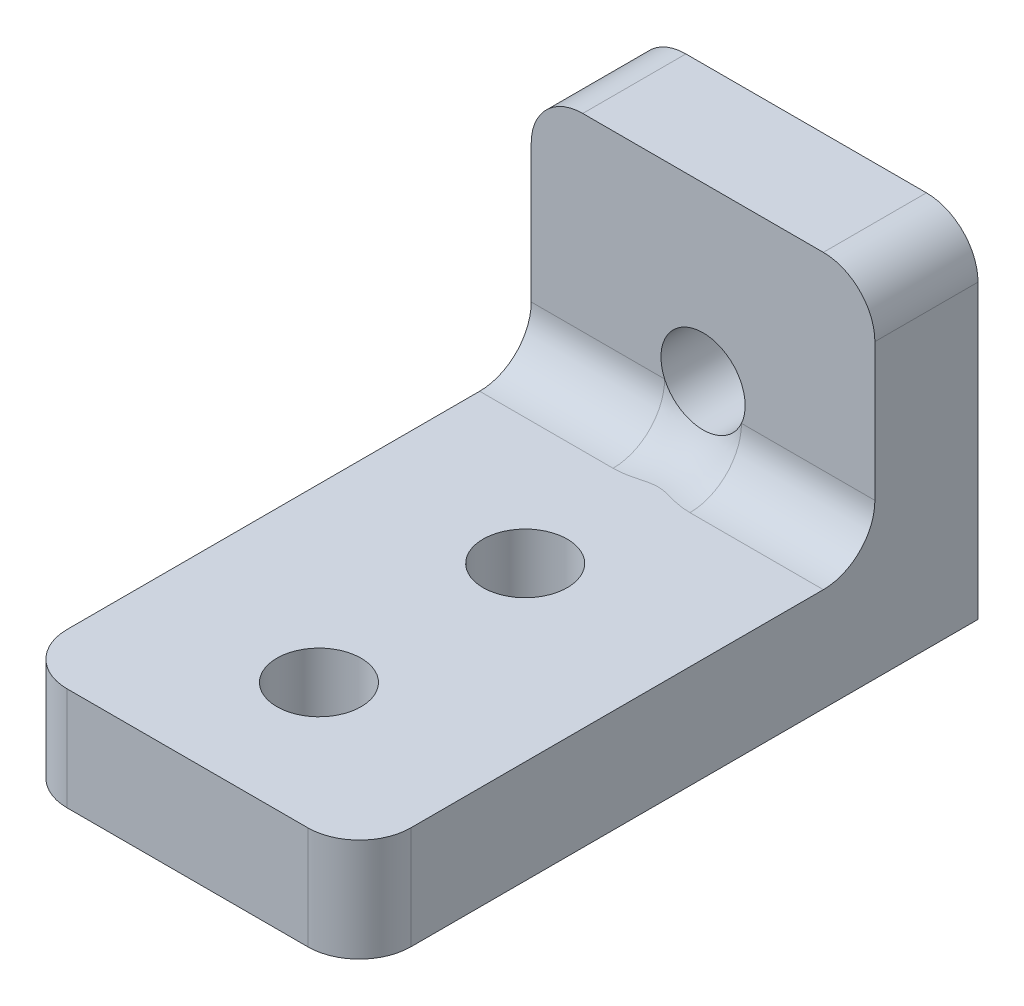
ISO-10303-21;
HEADER;
FILE_DESCRIPTION(('STEP AP214'),'2;1');
FILE_NAME('part.step','',(''),(''),'','','');
FILE_SCHEMA(('AUTOMOTIVE_DESIGN { 1 0 10303 214 1 1 1 1 }'));
ENDSEC;
DATA;
#1=APPLICATION_CONTEXT('core data for automotive mechanical design processes');
#2=APPLICATION_PROTOCOL_DEFINITION('international standard','automotive_design',2000,#1);
#3=PRODUCT_CONTEXT('',#1,'mechanical');
#4=PRODUCT('Part','Part','',(#3));
#5=PRODUCT_RELATED_PRODUCT_CATEGORY('part','',(#4));
#6=PRODUCT_DEFINITION_FORMATION('','',#4);
#7=PRODUCT_DEFINITION_CONTEXT('part definition',#1,'design');
#8=PRODUCT_DEFINITION('design','',#6,#7);
#9=PRODUCT_DEFINITION_SHAPE('','',#8);
#10=(LENGTH_UNIT() NAMED_UNIT(*) SI_UNIT(.MILLI.,.METRE.));
#11=(NAMED_UNIT(*) PLANE_ANGLE_UNIT() SI_UNIT($,.RADIAN.));
#12=(NAMED_UNIT(*) SI_UNIT($,.STERADIAN.) SOLID_ANGLE_UNIT());
#13=UNCERTAINTY_MEASURE_WITH_UNIT(LENGTH_MEASURE(1.E-05),#10,'distance_accuracy_value','');
#14=(GEOMETRIC_REPRESENTATION_CONTEXT(3) GLOBAL_UNCERTAINTY_ASSIGNED_CONTEXT((#13)) GLOBAL_UNIT_ASSIGNED_CONTEXT((#10,
#11,#12)) REPRESENTATION_CONTEXT('',''));
#15=CARTESIAN_POINT('',(0.,0.,0.));
#16=DIRECTION('',(0.,0.,1.));
#17=DIRECTION('',(1.,0.,0.));
#18=AXIS2_PLACEMENT_3D('',#15,#16,#17);
#19=CARTESIAN_POINT('',(0.,0.,6.));
#20=DIRECTION('',(1.,0.,0.));
#21=DIRECTION('',(0.,1.,0.));
#22=AXIS2_PLACEMENT_3D('',#19,#20,#21);
#23=PLANE('',#22);
#24=DIRECTION('',(0.,-1.,0.));
#25=VECTOR('',#24,1.);
#26=CARTESIAN_POINT('',(0.,0.,6.));
#27=LINE('',#26,#25);
#28=CARTESIAN_POINT('',(0.,-3.,6.));
#29=VERTEX_POINT('',#28);
#30=CARTESIAN_POINT('',(0.,-11.,6.));
#31=VERTEX_POINT('',#30);
#32=EDGE_CURVE('E167',#29,#31,#27,.T.);
#33=ORIENTED_EDGE('',*,*,#32,.F.);
#34=DIRECTION('',(0.,0.,-1.));
#35=VECTOR('',#34,1.);
#36=CARTESIAN_POINT('',(0.,-3.,6.));
#37=LINE('',#36,#35);
#38=CARTESIAN_POINT('',(0.,-3.,0.));
#39=VERTEX_POINT('',#38);
#40=EDGE_CURVE('E153',#29,#39,#37,.T.);
#41=ORIENTED_EDGE('',*,*,#40,.T.);
#42=DIRECTION('',(0.,-1.,0.));
#43=VECTOR('',#42,1.);
#44=CARTESIAN_POINT('',(0.,0.,0.));
#45=LINE('',#44,#43);
#46=CARTESIAN_POINT('',(0.,-20.,0.));
#47=VERTEX_POINT('',#46);
#48=EDGE_CURVE('E151',#39,#47,#45,.T.);
#49=ORIENTED_EDGE('',*,*,#48,.T.);
#50=DIRECTION('',(0.,0.,-1.));
#51=VECTOR('',#50,1.);
#52=CARTESIAN_POINT('',(0.,-20.,6.));
#53=LINE('',#52,#51);
#54=CARTESIAN_POINT('',(0.,-20.,33.));
#55=VERTEX_POINT('',#54);
#56=EDGE_CURVE('E136',#55,#47,#53,.T.);
#57=ORIENTED_EDGE('',*,*,#56,.F.);
#58=DIRECTION('',(0.,-1.,0.));
#59=VECTOR('',#58,1.);
#60=CARTESIAN_POINT('',(0.,0.,33.));
#61=LINE('',#60,#59);
#62=CARTESIAN_POINT('',(0.,-14.,33.));
#63=VERTEX_POINT('',#62);
#64=EDGE_CURVE('E146',#55,#63,#61,.F.);
#65=ORIENTED_EDGE('',*,*,#64,.T.);
#66=DIRECTION('',(0.,0.,-1.));
#67=VECTOR('',#66,1.);
#68=CARTESIAN_POINT('',(0.,-14.,36.));
#69=LINE('',#68,#67);
#70=CARTESIAN_POINT('',(0.,-14.,9.));
#71=VERTEX_POINT('',#70);
#72=EDGE_CURVE('E267',#63,#71,#69,.T.);
#73=ORIENTED_EDGE('',*,*,#72,.T.);
#74=CARTESIAN_POINT('',(0.,-11.,9.));
#75=DIRECTION('',(1.,0.,0.));
#76=DIRECTION('',(0.,1.,0.));
#77=AXIS2_PLACEMENT_3D('',#74,#75,#76);
#78=CIRCLE('',#77,3.);
#79=EDGE_CURVE('E48',#71,#31,#78,.T.);
#80=ORIENTED_EDGE('',*,*,#79,.T.);
#81=EDGE_LOOP('',(#33,#41,#49,#57,#65,#73,#80));
#82=FACE_BOUND('',#81,.T.);
#83=ADVANCED_FACE('F35',(#82),#23,.F.);
#84=CARTESIAN_POINT('',(0.,-20.,6.));
#85=DIRECTION('',(0.,1.,0.));
#86=DIRECTION('',(0.,0.,1.));
#87=AXIS2_PLACEMENT_3D('',#84,#85,#86);
#88=PLANE('',#87);
#89=CARTESIAN_POINT('',(10.,-20.,16.35));
#90=DIRECTION('',(0.,1.,0.));
#91=DIRECTION('',(0.,0.,1.));
#92=AXIS2_PLACEMENT_3D('',#89,#90,#91);
#93=CIRCLE('',#92,2.45);
#94=CARTESIAN_POINT('',(10.,-20.,18.8));
#95=VERTEX_POINT('',#94);
#96=EDGE_CURVE('E246',#95,#95,#93,.T.);
#97=ORIENTED_EDGE('',*,*,#96,.T.);
#98=EDGE_LOOP('',(#97));
#99=FACE_BOUND('',#98,.T.);
#100=CARTESIAN_POINT('',(10.,-20.,28.35));
#101=DIRECTION('',(0.,1.,0.));
#102=DIRECTION('',(0.,0.,1.));
#103=AXIS2_PLACEMENT_3D('',#100,#101,#102);
#104=CIRCLE('',#103,2.45);
#105=CARTESIAN_POINT('',(10.,-20.,30.8));
#106=VERTEX_POINT('',#105);
#107=EDGE_CURVE('E314',#106,#106,#104,.T.);
#108=ORIENTED_EDGE('',*,*,#107,.T.);
#109=EDGE_LOOP('',(#108));
#110=FACE_BOUND('',#109,.T.);
#111=DIRECTION('',(0.,0.,-1.));
#112=VECTOR('',#111,1.);
#113=CARTESIAN_POINT('',(20.,-20.,6.));
#114=LINE('',#113,#112);
#115=CARTESIAN_POINT('',(20.,-20.,33.));
#116=VERTEX_POINT('',#115);
#117=CARTESIAN_POINT('',(20.,-20.,0.));
#118=VERTEX_POINT('',#117);
#119=EDGE_CURVE('E147',#116,#118,#114,.T.);
#120=ORIENTED_EDGE('',*,*,#119,.F.);
#121=CARTESIAN_POINT('',(17.,-20.,33.));
#122=DIRECTION('',(0.,1.,0.));
#123=DIRECTION('',(0.,0.,1.));
#124=AXIS2_PLACEMENT_3D('',#121,#122,#123);
#125=CIRCLE('',#124,3.);
#126=CARTESIAN_POINT('',(17.,-20.,36.));
#127=VERTEX_POINT('',#126);
#128=EDGE_CURVE('E201',#116,#127,#125,.F.);
#129=ORIENTED_EDGE('',*,*,#128,.T.);
#130=DIRECTION('',(1.,0.,0.));
#131=VECTOR('',#130,1.);
#132=CARTESIAN_POINT('',(0.,-20.,36.));
#133=LINE('',#132,#131);
#134=CARTESIAN_POINT('',(3.,-20.,36.));
#135=VERTEX_POINT('',#134);
#136=EDGE_CURVE('E273',#135,#127,#133,.T.);
#137=ORIENTED_EDGE('',*,*,#136,.F.);
#138=CARTESIAN_POINT('',(3.,-20.,33.));
#139=DIRECTION('',(0.,1.,0.));
#140=DIRECTION('',(0.,0.,1.));
#141=AXIS2_PLACEMENT_3D('',#138,#139,#140);
#142=CIRCLE('',#141,3.);
#143=EDGE_CURVE('E144',#135,#55,#142,.F.);
#144=ORIENTED_EDGE('',*,*,#143,.T.);
#145=ORIENTED_EDGE('',*,*,#56,.T.);
#146=DIRECTION('',(1.,0.,0.));
#147=VECTOR('',#146,1.);
#148=CARTESIAN_POINT('',(0.,-20.,0.));
#149=LINE('',#148,#147);
#150=EDGE_CURVE('E141',#47,#118,#149,.T.);
#151=ORIENTED_EDGE('',*,*,#150,.T.);
#152=EDGE_LOOP('',(#120,#129,#137,#144,#145,#151));
#153=FACE_BOUND('',#152,.T.);
#154=ADVANCED_FACE('F139',(#99,#110,#153),#88,.F.);
#155=CARTESIAN_POINT('',(20.,0.,6.));
#156=DIRECTION('',(-1.,0.,0.));
#157=DIRECTION('',(0.,-1.,0.));
#158=AXIS2_PLACEMENT_3D('',#155,#156,#157);
#159=PLANE('',#158);
#160=DIRECTION('',(0.,1.,0.));
#161=VECTOR('',#160,1.);
#162=CARTESIAN_POINT('',(20.,0.,0.));
#163=LINE('',#162,#161);
#164=CARTESIAN_POINT('',(20.,-3.,0.));
#165=VERTEX_POINT('',#164);
#166=EDGE_CURVE('E159',#118,#165,#163,.T.);
#167=ORIENTED_EDGE('',*,*,#166,.T.);
#168=DIRECTION('',(0.,0.,-1.));
#169=VECTOR('',#168,1.);
#170=CARTESIAN_POINT('',(20.,-3.,6.));
#171=LINE('',#170,#169);
#172=CARTESIAN_POINT('',(20.,-3.,6.));
#173=VERTEX_POINT('',#172);
#174=EDGE_CURVE('E187',#165,#173,#171,.F.);
#175=ORIENTED_EDGE('',*,*,#174,.T.);
#176=DIRECTION('',(0.,1.,0.));
#177=VECTOR('',#176,1.);
#178=CARTESIAN_POINT('',(20.,0.,6.));
#179=LINE('',#178,#177);
#180=CARTESIAN_POINT('',(20.,-11.,6.));
#181=VERTEX_POINT('',#180);
#182=EDGE_CURVE('E278',#181,#173,#179,.T.);
#183=ORIENTED_EDGE('',*,*,#182,.F.);
#184=CARTESIAN_POINT('',(20.,-11.,9.));
#185=DIRECTION('',(-1.,0.,0.));
#186=DIRECTION('',(0.,-1.,0.));
#187=AXIS2_PLACEMENT_3D('',#184,#185,#186);
#188=CIRCLE('',#187,3.);
#189=CARTESIAN_POINT('',(20.,-14.,9.));
#190=VERTEX_POINT('',#189);
#191=EDGE_CURVE('E11',#181,#190,#188,.T.);
#192=ORIENTED_EDGE('',*,*,#191,.T.);
#193=DIRECTION('',(0.,0.,-1.));
#194=VECTOR('',#193,1.);
#195=CARTESIAN_POINT('',(20.,-14.,36.));
#196=LINE('',#195,#194);
#197=CARTESIAN_POINT('',(20.,-14.,33.));
#198=VERTEX_POINT('',#197);
#199=EDGE_CURVE('E155',#198,#190,#196,.T.);
#200=ORIENTED_EDGE('',*,*,#199,.F.);
#201=DIRECTION('',(0.,1.,0.));
#202=VECTOR('',#201,1.);
#203=CARTESIAN_POINT('',(20.,0.,33.));
#204=LINE('',#203,#202);
#205=EDGE_CURVE('E185',#198,#116,#204,.F.);
#206=ORIENTED_EDGE('',*,*,#205,.T.);
#207=ORIENTED_EDGE('',*,*,#119,.T.);
#208=EDGE_LOOP('',(#167,#175,#183,#192,#200,#206,#207));
#209=FACE_BOUND('',#208,.T.);
#210=ADVANCED_FACE('F294',(#209),#159,.F.);
#211=CARTESIAN_POINT('',(0.,0.,6.));
#212=DIRECTION('',(0.,-1.,0.));
#213=DIRECTION('',(0.,0.,-1.));
#214=AXIS2_PLACEMENT_3D('',#211,#212,#213);
#215=PLANE('',#214);
#216=DIRECTION('',(-1.,0.,0.));
#217=VECTOR('',#216,1.);
#218=CARTESIAN_POINT('',(0.,0.,0.));
#219=LINE('',#218,#217);
#220=CARTESIAN_POINT('',(17.,0.,0.));
#221=VERTEX_POINT('',#220);
#222=CARTESIAN_POINT('',(3.,0.,0.));
#223=VERTEX_POINT('',#222);
#224=EDGE_CURVE('E161',#221,#223,#219,.T.);
#225=ORIENTED_EDGE('',*,*,#224,.T.);
#226=DIRECTION('',(0.,0.,-1.));
#227=VECTOR('',#226,1.);
#228=CARTESIAN_POINT('',(3.,0.,6.));
#229=LINE('',#228,#227);
#230=CARTESIAN_POINT('',(3.,0.,6.));
#231=VERTEX_POINT('',#230);
#232=EDGE_CURVE('E179',#223,#231,#229,.F.);
#233=ORIENTED_EDGE('',*,*,#232,.T.);
#234=DIRECTION('',(-1.,0.,0.));
#235=VECTOR('',#234,1.);
#236=CARTESIAN_POINT('',(0.,0.,6.));
#237=LINE('',#236,#235);
#238=CARTESIAN_POINT('',(17.,0.,6.));
#239=VERTEX_POINT('',#238);
#240=EDGE_CURVE('E168',#239,#231,#237,.T.);
#241=ORIENTED_EDGE('',*,*,#240,.F.);
#242=DIRECTION('',(0.,0.,-1.));
#243=VECTOR('',#242,1.);
#244=CARTESIAN_POINT('',(17.,0.,6.));
#245=LINE('',#244,#243);
#246=EDGE_CURVE('E176',#239,#221,#245,.T.);
#247=ORIENTED_EDGE('',*,*,#246,.T.);
#248=EDGE_LOOP('',(#225,#233,#241,#247));
#249=FACE_BOUND('',#248,.T.);
#250=ADVANCED_FACE('F289',(#249),#215,.F.);
#251=CARTESIAN_POINT('',(0.,0.,6.));
#252=DIRECTION('',(0.,0.,1.));
#253=DIRECTION('',(1.,0.,0.));
#254=AXIS2_PLACEMENT_3D('',#251,#252,#253);
#255=PLANE('',#254);
#256=ORIENTED_EDGE('',*,*,#32,.T.);
#257=DIRECTION('',(-1.,0.,0.));
#258=VECTOR('',#257,1.);
#259=CARTESIAN_POINT('',(0.,-11.,6.));
#260=LINE('',#259,#258);
#261=CARTESIAN_POINT('',(7.76337307536549,-11.,6.));
#262=VERTEX_POINT('',#261);
#263=EDGE_CURVE('E249',#31,#262,#260,.F.);
#264=ORIENTED_EDGE('',*,*,#263,.T.);
#265=CARTESIAN_POINT('',(10.,-10.,6.));
#266=DIRECTION('',(0.,0.,1.));
#267=DIRECTION('',(1.,0.,0.));
#268=AXIS2_PLACEMENT_3D('',#265,#266,#267);
#269=CIRCLE('',#268,2.45);
#270=CARTESIAN_POINT('',(12.2366269246345,-11.,6.));
#271=VERTEX_POINT('',#270);
#272=EDGE_CURVE('E310',#271,#262,#269,.T.);
#273=ORIENTED_EDGE('',*,*,#272,.F.);
#274=DIRECTION('',(-1.,0.,0.));
#275=VECTOR('',#274,1.);
#276=CARTESIAN_POINT('',(0.,-11.,6.));
#277=LINE('',#276,#275);
#278=EDGE_CURVE('E56',#271,#181,#277,.F.);
#279=ORIENTED_EDGE('',*,*,#278,.T.);
#280=ORIENTED_EDGE('',*,*,#182,.T.);
#281=CARTESIAN_POINT('',(17.,-3.,6.));
#282=DIRECTION('',(0.,0.,1.));
#283=DIRECTION('',(1.,0.,0.));
#284=AXIS2_PLACEMENT_3D('',#281,#282,#283);
#285=CIRCLE('',#284,3.);
#286=EDGE_CURVE('E181',#173,#239,#285,.T.);
#287=ORIENTED_EDGE('',*,*,#286,.T.);
#288=ORIENTED_EDGE('',*,*,#240,.T.);
#289=CARTESIAN_POINT('',(3.,-3.,6.));
#290=DIRECTION('',(0.,0.,1.));
#291=DIRECTION('',(1.,0.,0.));
#292=AXIS2_PLACEMENT_3D('',#289,#290,#291);
#293=CIRCLE('',#292,3.);
#294=EDGE_CURVE('E183',#231,#29,#293,.T.);
#295=ORIENTED_EDGE('',*,*,#294,.T.);
#296=EDGE_LOOP('',(#256,#264,#273,#279,#280,#287,#288,#295));
#297=FACE_BOUND('',#296,.T.);
#298=ADVANCED_FACE('F233',(#297),#255,.T.);
#299=CARTESIAN_POINT('',(0.,0.,0.));
#300=DIRECTION('',(0.,0.,1.));
#301=DIRECTION('',(1.,0.,0.));
#302=AXIS2_PLACEMENT_3D('',#299,#300,#301);
#303=PLANE('',#302);
#304=CARTESIAN_POINT('',(10.,-10.,0.));
#305=DIRECTION('',(0.,0.,1.));
#306=DIRECTION('',(1.,0.,0.));
#307=AXIS2_PLACEMENT_3D('',#304,#305,#306);
#308=CIRCLE('',#307,2.45);
#309=CARTESIAN_POINT('',(12.45,-10.,0.));
#310=VERTEX_POINT('',#309);
#311=EDGE_CURVE('E306',#310,#310,#308,.T.);
#312=ORIENTED_EDGE('',*,*,#311,.T.);
#313=EDGE_LOOP('',(#312));
#314=FACE_BOUND('',#313,.T.);
#315=ORIENTED_EDGE('',*,*,#48,.F.);
#316=CARTESIAN_POINT('',(3.,-3.,0.));
#317=DIRECTION('',(0.,0.,1.));
#318=DIRECTION('',(1.,0.,0.));
#319=AXIS2_PLACEMENT_3D('',#316,#317,#318);
#320=CIRCLE('',#319,3.);
#321=EDGE_CURVE('E174',#39,#223,#320,.F.);
#322=ORIENTED_EDGE('',*,*,#321,.T.);
#323=ORIENTED_EDGE('',*,*,#224,.F.);
#324=CARTESIAN_POINT('',(17.,-3.,0.));
#325=DIRECTION('',(0.,0.,1.));
#326=DIRECTION('',(1.,0.,0.));
#327=AXIS2_PLACEMENT_3D('',#324,#325,#326);
#328=CIRCLE('',#327,3.);
#329=EDGE_CURVE('E172',#221,#165,#328,.F.);
#330=ORIENTED_EDGE('',*,*,#329,.T.);
#331=ORIENTED_EDGE('',*,*,#166,.F.);
#332=ORIENTED_EDGE('',*,*,#150,.F.);
#333=EDGE_LOOP('',(#315,#322,#323,#330,#331,#332));
#334=FACE_BOUND('',#333,.T.);
#335=ADVANCED_FACE('F157',(#314,#334),#303,.F.);
#336=CARTESIAN_POINT('',(0.,-14.,36.));
#337=DIRECTION('',(0.,-1.,0.));
#338=DIRECTION('',(0.,0.,-1.));
#339=AXIS2_PLACEMENT_3D('',#336,#337,#338);
#340=PLANE('',#339);
#341=CARTESIAN_POINT('',(10.,-14.,16.35));
#342=DIRECTION('',(0.,1.,0.));
#343=DIRECTION('',(0.,0.,1.));
#344=AXIS2_PLACEMENT_3D('',#341,#342,#343);
#345=CIRCLE('',#344,2.45);
#346=CARTESIAN_POINT('',(10.,-14.,18.8));
#347=VERTEX_POINT('',#346);
#348=EDGE_CURVE('E317',#347,#347,#345,.T.);
#349=ORIENTED_EDGE('',*,*,#348,.F.);
#350=EDGE_LOOP('',(#349));
#351=FACE_BOUND('',#350,.T.);
#352=CARTESIAN_POINT('',(10.,-14.,28.35));
#353=DIRECTION('',(0.,1.,0.));
#354=DIRECTION('',(0.,0.,1.));
#355=AXIS2_PLACEMENT_3D('',#352,#353,#354);
#356=CIRCLE('',#355,2.45);
#357=CARTESIAN_POINT('',(10.,-14.,30.8));
#358=VERTEX_POINT('',#357);
#359=EDGE_CURVE('E244',#358,#358,#356,.T.);
#360=ORIENTED_EDGE('',*,*,#359,.F.);
#361=EDGE_LOOP('',(#360));
#362=FACE_BOUND('',#361,.T.);
#363=ORIENTED_EDGE('',*,*,#199,.T.);
#364=DIRECTION('',(-1.,0.,0.));
#365=VECTOR('',#364,1.);
#366=CARTESIAN_POINT('',(0.,-14.,9.));
#367=LINE('',#366,#365);
#368=CARTESIAN_POINT('',(12.2366269246345,-14.,9.));
#369=VERTEX_POINT('',#368);
#370=EDGE_CURVE('E212',#190,#369,#367,.T.);
#371=ORIENTED_EDGE('',*,*,#370,.T.);
#372=CARTESIAN_POINT('',(13.0365617826891,-14.,8.90551453709537));
#373=CARTESIAN_POINT('',(12.2671345198766,-14.,5.75459280735491));
#374=CARTESIAN_POINT('',(12.327060789301,-10.7663472338947,6.));
#375=CARTESIAN_POINT('',(12.950544525121,-14.,8.92653785787751));
#376=CARTESIAN_POINT('',(12.2727685529418,-14.,5.77504625912289));
#377=CARTESIAN_POINT('',(12.3205645673813,-10.7859610895519,6.));
#378=CARTESIAN_POINT('',(12.8636715647208,-14.,8.94397317100025));
#379=CARTESIAN_POINT('',(12.2762584291691,-14.,5.79770823634785));
#380=CARTESIAN_POINT('',(12.3133511153935,-10.8071329363144,6.));
#381=CARTESIAN_POINT('',(12.6888656537901,-14.,8.97181030915909));
#382=CARTESIAN_POINT('',(12.2772754312158,-14.,5.8473045584266));
#383=CARTESIAN_POINT('',(12.2967096075349,-10.853391096599,6.));
#384=CARTESIAN_POINT('',(12.6009334954214,-14.,8.98221709415954));
#385=CARTESIAN_POINT('',(12.274854367162,-14.,5.8741694143294));
#386=CARTESIAN_POINT('',(12.287283119726,-10.8784746342597,6.));
#387=CARTESIAN_POINT('',(12.4266088739132,-14.,8.99600513188879));
#388=CARTESIAN_POINT('',(12.2627529840783,-14.,5.93134791522549));
#389=CARTESIAN_POINT('',(12.265685082357,-10.9327353040991,6.));
#390=CARTESIAN_POINT('',(12.3402287535566,-14.,8.99954564943073));
#391=CARTESIAN_POINT('',(12.2533195839148,-14.,5.96148274376604));
#392=CARTESIAN_POINT('',(12.2535832045833,-10.96180245544,6.));
#393=CARTESIAN_POINT('',(12.1674402637124,-14.,9.00037198805817));
#394=CARTESIAN_POINT('',(12.2256986531207,-14.,6.02540054796675));
#395=CARTESIAN_POINT('',(12.2253494189193,-11.0254475427794,6.));
#396=CARTESIAN_POINT('',(12.0810318928287,-14.,8.99765742957989));
#397=CARTESIAN_POINT('',(12.2076254829321,-14.,6.05909253196025));
#398=CARTESIAN_POINT('',(12.2092172665213,-11.0600258130793,6.));
#399=CARTESIAN_POINT('',(11.9135121384518,-14.,8.98671822224657));
#400=CARTESIAN_POINT('',(12.1620406009486,-14.,6.12768938445565));
#401=CARTESIAN_POINT('',(12.172279975139,-11.1337123927012,6.));
#402=CARTESIAN_POINT('',(11.8323789624775,-14.,8.97881569303437));
#403=CARTESIAN_POINT('',(12.1352900201211,-14.,6.16230209727629));
#404=CARTESIAN_POINT('',(12.1517927426418,-11.1724512728408,6.));
#405=CARTESIAN_POINT('',(11.6707128684689,-14.,8.95833186844076));
#406=CARTESIAN_POINT('',(12.070207958549,-14.,6.2338057435577));
#407=CARTESIAN_POINT('',(12.1035228370925,-11.2570114903926,6.));
#408=CARTESIAN_POINT('',(11.5901799704451,-14.,8.94575041779077));
#409=CARTESIAN_POINT('',(12.0320888194822,-14.,6.27059857516587));
#410=CARTESIAN_POINT('',(12.0757399219444,-11.3028330628123,6.));
#411=CARTESIAN_POINT('',(11.428780591885,-14.,8.91641950068636));
#412=CARTESIAN_POINT('',(11.9412665720138,-14.,6.34613746234845));
#413=CARTESIAN_POINT('',(12.009183476074,-11.4033453992312,6.));
#414=CARTESIAN_POINT('',(11.3479239885203,-14.,8.89961668053617));
#415=CARTESIAN_POINT('',(11.888675952151,-14.,6.38480762201303));
#416=CARTESIAN_POINT('',(11.9702682979208,-11.4581463066904,6.));
#417=CARTESIAN_POINT('',(11.1869406384162,-14.,8.8629601759956));
#418=CARTESIAN_POINT('',(11.7661398757111,-14.,6.46242452436431));
#419=CARTESIAN_POINT('',(11.876549343097,-11.5769803796752,6.));
#420=CARTESIAN_POINT('',(11.1068137363196,-14.,8.84310715789248));
#421=CARTESIAN_POINT('',(11.6966190937893,-14.,6.50128243428658));
#422=CARTESIAN_POINT('',(11.8217490340723,-11.6410115287524,6.));
#423=CARTESIAN_POINT('',(10.981548909411,-14.,8.81078842870554));
#424=CARTESIAN_POINT('',(11.5708695716652,-14.,6.56119443103939));
#425=CARTESIAN_POINT('',(11.7175097886372,-11.7480057732518,6.));
#426=CARTESIAN_POINT('',(10.9362726581216,-14.,8.79884309708353));
#427=CARTESIAN_POINT('',(11.5223186752119,-14.,6.5825321402209));
#428=CARTESIAN_POINT('',(11.6760103533544,-11.7880972077437,6.));
#429=CARTESIAN_POINT('',(10.8457482702793,-14.,8.7748417747122));
#430=CARTESIAN_POINT('',(11.4179608633197,-14.,6.62423402405267));
#431=CARTESIAN_POINT('',(11.5837060078164,-11.8703518141045,6.));
#432=CARTESIAN_POINT('',(10.8005001342925,-14.,8.76278578180708));
#433=CARTESIAN_POINT('',(11.3622498068158,-14.,6.64460097121125));
#434=CARTESIAN_POINT('',(11.532900915911,-11.9125150264037,6.));
#435=CARTESIAN_POINT('',(10.7098522472347,-14.,8.73901772686773));
#436=CARTESIAN_POINT('',(11.2429581441491,-14.,6.68382781910003));
#437=CARTESIAN_POINT('',(11.4200368018224,-11.9977482424769,6.));
#438=CARTESIAN_POINT('',(10.6644523775999,-14.,8.72730611112792));
#439=CARTESIAN_POINT('',(11.1794527029501,-14.,6.70270166754134));
#440=CARTESIAN_POINT('',(11.3579638647006,-12.0408193085943,6.));
#441=CARTESIAN_POINT('',(10.5734110124547,-14.,8.70483262406374));
#442=CARTESIAN_POINT('',(11.0443006766421,-14.,6.73821948518049));
#443=CARTESIAN_POINT('',(11.2208245530124,-12.1256960575177,6.));
#444=CARTESIAN_POINT('',(10.5277695057459,-14.,8.69407079717235));
#445=CARTESIAN_POINT('',(10.9727055887454,-14.,6.75489467056522));
#446=CARTESIAN_POINT('',(11.145757571045,-12.1675016810637,6.));
#447=CARTESIAN_POINT('',(10.437109122417,-14.,8.67442303162621));
#448=CARTESIAN_POINT('',(10.8231650641595,-14.,6.78486274097386));
#449=CARTESIAN_POINT('',(10.9833705672915,-12.2457531510214,6.));
#450=CARTESIAN_POINT('',(10.3920981432613,-14.,8.66550154076126));
#451=CARTESIAN_POINT('',(10.7453902313033,-14.,6.79826217195292));
#452=CARTESIAN_POINT('',(10.8963508284343,-12.2822953999303,6.));
#453=CARTESIAN_POINT('',(10.3016702660815,-14.,8.64998703539409));
#454=CARTESIAN_POINT('',(10.583163793261,-14.,6.82128803288532));
#455=CARTESIAN_POINT('',(10.7095099223144,-12.3470902245504,6.));
#456=CARTESIAN_POINT('',(10.2562534252292,-14.,8.64339369807688));
#457=CARTESIAN_POINT('',(10.4986014606225,-14.,6.83096602426967));
#458=CARTESIAN_POINT('',(10.6096905324326,-12.3753439494324,6.));
#459=CARTESIAN_POINT('',(10.1652227373956,-14.,8.63323906723665));
#460=CARTESIAN_POINT('',(10.3251062873808,-14.,6.8457530614487));
#461=CARTESIAN_POINT('',(10.4007330627427,-12.4193452558386,6.));
#462=CARTESIAN_POINT('',(10.119610050473,-14.,8.62966774769537));
#463=CARTESIAN_POINT('',(10.2359677160294,-14.,6.8509205397342));
#464=CARTESIAN_POINT('',(10.2916271291624,-12.4351341795152,6.));
#465=CARTESIAN_POINT('',(10.0282450133182,-14.,8.62596024988169));
#466=CARTESIAN_POINT('',(10.0561370128784,-14.,6.85626573420137));
#467=CARTESIAN_POINT('',(10.0696319293313,-12.4515305218565,6.));
#468=CARTESIAN_POINT('',(9.98249268528217,-14.,8.62582355148776));
#469=CARTESIAN_POINT('',(9.96514115577088,-14.,6.85646252189433));
#470=CARTESIAN_POINT('',(9.95674323851468,-12.4521402391826,6.));
#471=CARTESIAN_POINT('',(9.89917184908834,-14.,8.62871595757469));
#472=CARTESIAN_POINT('',(9.80095418748489,-14.,6.85229462695731));
#473=CARTESIAN_POINT('',(9.75383279817249,-12.4393418337199,6.));
#474=CARTESIAN_POINT('',(9.86158247490364,-14.,8.63119122621437));
#475=CARTESIAN_POINT('',(9.72724352539006,-14.,6.84871821411466));
#476=CARTESIAN_POINT('',(9.66328812619092,-12.4283858997181,6.));
#477=CARTESIAN_POINT('',(9.78660589040351,-14.,8.63826400139416));
#478=CARTESIAN_POINT('',(9.58275982857863,-14.,6.83845404196604));
#479=CARTESIAN_POINT('',(9.48780708158659,-12.3975192645117,6.));
#480=CARTESIAN_POINT('',(9.74921869207466,-14.,8.64286163239865));
#481=CARTESIAN_POINT('',(9.51184884908206,-14.,6.83174462883399));
#482=CARTESIAN_POINT('',(9.40287103821172,-12.3776080381322,6.));
#483=CARTESIAN_POINT('',(9.67461280939761,-14.,8.6538493824757));
#484=CARTESIAN_POINT('',(9.37401559402963,-14.,6.81558787544247));
#485=CARTESIAN_POINT('',(9.24068185116221,-12.3309003660829,6.));
#486=CARTESIAN_POINT('',(9.63739484377067,-14.,8.66024426555782));
#487=CARTESIAN_POINT('',(9.30701591629643,-14.,6.80610548369246));
#488=CARTESIAN_POINT('',(9.16344987623396,-12.3040856372489,6.));
#489=CARTESIAN_POINT('',(9.56322669984344,-14.,8.67441398938985));
#490=CARTESIAN_POINT('',(9.17792874462714,-14.,6.7848709001472));
#491=CARTESIAN_POINT('',(9.01795485672647,-12.2459375775546,6.));
#492=CARTESIAN_POINT('',(9.52627652845869,-14.,8.68218886564554));
#493=CARTESIAN_POINT('',(9.11580175832405,-14.,6.77309105004777));
#494=CARTESIAN_POINT('',(8.94969204299301,-12.2146041304364,6.));
#495=CARTESIAN_POINT('',(9.451788794316,-14.,8.69889726358656));
#496=CARTESIAN_POINT('',(8.99543308598071,-14.,6.74743338056041));
#497=CARTESIAN_POINT('',(8.82076079380819,-12.1487801354903,6.));
#498=CARTESIAN_POINT('',(9.41425618166812,-14.,8.70785250364928));
#499=CARTESIAN_POINT('',(8.93731770478351,-14.,6.73349317178586));
#500=CARTESIAN_POINT('',(8.7602923599203,-12.1142353159639,6.));
#501=CARTESIAN_POINT('',(9.33935023817942,-14.,8.7263948735707));
#502=CARTESIAN_POINT('',(8.82651664931233,-14.,6.70415232629522));
#503=CARTESIAN_POINT('',(8.64810738321136,-12.0443231011467,6.));
#504=CARTESIAN_POINT('',(9.3019769046545,-14.,8.73598199273608));
#505=CARTESIAN_POINT('',(8.77386028569305,-14.,6.6887344489359));
#506=CARTESIAN_POINT('',(8.59639069233703,-12.0089557197828,6.));
#507=CARTESIAN_POINT('',(9.22734265156551,-14.,8.75544641793847));
#508=CARTESIAN_POINT('',(8.67382220222305,-14.,6.6568286390634));
#509=CARTESIAN_POINT('',(8.50077796987113,-11.9386473786948,6.));
#510=CARTESIAN_POINT('',(9.190081661043,-14.,8.76532345464444));
#511=CARTESIAN_POINT('',(8.62648099010869,-14.,6.64033158394925));
#512=CARTESIAN_POINT('',(8.45687493159131,-11.90370606337,6.));
#513=CARTESIAN_POINT('',(9.11556547013053,-14.,8.78509942897688));
#514=CARTESIAN_POINT('',(8.53672300682972,-14.,6.60656908865017));
#515=CARTESIAN_POINT('',(8.3757806684797,-11.8350008591029,6.));
#516=CARTESIAN_POINT('',(9.07831026977682,-14.,8.79499836673503));
#517=CARTESIAN_POINT('',(8.4943587770109,-14.,6.58929992159014));
#518=CARTESIAN_POINT('',(8.33858948411502,-11.8012369772607,6.));
#519=CARTESIAN_POINT('',(8.98041138492561,-14.,8.82071281513757));
#520=CARTESIAN_POINT('',(8.38884955178722,-14.,6.54317445903311));
#521=CARTESIAN_POINT('',(8.24840042123705,-11.7147663866942,6.));
#522=CARTESIAN_POINT('',(8.91972109428258,-14.,8.8363542906332));
#523=CARTESIAN_POINT('',(8.32994598279866,-14.,6.5140398979581));
#524=CARTESIAN_POINT('',(8.20007549091522,-11.6634278736897,6.));
#525=CARTESIAN_POINT('',(8.79800815706332,-14.,8.86629946491834));
#526=CARTESIAN_POINT('',(8.22270040837681,-14.,6.45535071535531));
#527=CARTESIAN_POINT('',(8.11471084941674,-11.5659993640964,6.));
#528=CARTESIAN_POINT('',(8.73698552065578,-14.,8.88060320439751));
#529=CARTESIAN_POINT('',(8.17456628488617,-14.,6.4258253821504));
#530=CARTESIAN_POINT('',(8.07767079491272,-11.5199092078599,6.));
#531=CARTESIAN_POINT('',(8.61451604345802,-14.,8.90730308531059));
#532=CARTESIAN_POINT('',(8.08749459768636,-14.,6.36701467652799));
#533=CARTESIAN_POINT('',(8.01200703326677,-11.4329505097849,6.));
#534=CARTESIAN_POINT('',(8.55306918344636,-14.,8.91969913970724));
#535=CARTESIAN_POINT('',(8.04872987280211,-14.,6.33777015676139));
#536=CARTESIAN_POINT('',(7.98338371008014,-11.3920822062054,6.));
#537=CARTESIAN_POINT('',(8.42974466439725,-14.,8.94214790065473));
#538=CARTESIAN_POINT('',(7.97919699625967,-14.,6.28003177336716));
#539=CARTESIAN_POINT('',(7.93242586304947,-11.3152021447751,6.));
#540=CARTESIAN_POINT('',(8.36786700546711,-14.,8.95220060778922));
#541=CARTESIAN_POINT('',(7.94856555294162,-14.,6.25158316297372));
#542=CARTESIAN_POINT('',(7.91009133763908,-11.2791903857146,6.));
#543=CARTESIAN_POINT('',(8.24469665891492,-14.,8.96949207210968));
#544=CARTESIAN_POINT('',(7.89467030590918,-14.,6.1962641717657));
#545=CARTESIAN_POINT('',(7.8704594534297,-11.2120440121243,6.));
#546=CARTESIAN_POINT('',(8.18340987687703,-14.,8.97677222950409));
#547=CARTESIAN_POINT('',(7.87139623773017,-14.,6.16941513585773));
#548=CARTESIAN_POINT('',(7.85308903866777,-11.1808421545096,6.));
#549=CARTESIAN_POINT('',(8.0605651631736,-14.,8.98849255430606));
#550=CARTESIAN_POINT('',(7.83070467346149,-14.,6.11710663750263));
#551=CARTESIAN_POINT('',(7.82184612309716,-11.1221589621458,6.));
#552=CARTESIAN_POINT('',(7.99900720820148,-14.,8.992932472611));
#553=CARTESIAN_POINT('',(7.81336436067606,-14.,6.09168816630153));
#554=CARTESIAN_POINT('',(7.80797392916389,-11.0946779538995,6.));
#555=CARTESIAN_POINT('',(7.81412276975832,-14.,9.0016837434753));
#556=CARTESIAN_POINT('',(7.76873748686156,-14.,6.01754789392832));
#557=CARTESIAN_POINT('',(7.77034465387252,-11.017102136033,6.));
#558=CARTESIAN_POINT('',(7.6905283738649,-14.,9.00143503579597));
#559=CARTESIAN_POINT('',(7.7495348528778,-14.,5.97176184296407));
#560=CARTESIAN_POINT('',(7.75055818293267,-10.9718442943704,6.));
#561=CARTESIAN_POINT('',(7.47855005606277,-14.,8.9896467745954));
#562=CARTESIAN_POINT('',(7.72938168918845,-14.,5.89957892996174));
#563=CARTESIAN_POINT('',(7.72204298917299,-10.9024144310989,6.));
#564=CARTESIAN_POINT('',(7.38997610390309,-14.,8.9812811158658));
#565=CARTESIAN_POINT('',(7.72491317217133,-14.,5.87134437465634));
#566=CARTESIAN_POINT('',(7.71176934974113,-10.8758839886044,6.));
#567=CARTESIAN_POINT('',(7.21379493814847,-14.,8.95749692741196));
#568=CARTESIAN_POINT('',(7.72225888944081,-14.,5.81902775009954));
#569=CARTESIAN_POINT('',(7.69364915553313,-10.8270020567596,6.));
#570=CARTESIAN_POINT('',(7.12618741405254,-14.,8.94208073477391));
#571=CARTESIAN_POINT('',(7.72412710904313,-14.,5.79501569884607));
#572=CARTESIAN_POINT('',(7.68580179794515,-10.8046491860985,6.));
#573=CARTESIAN_POINT('',(6.95029998400188,-14.,8.90360083029957));
#574=CARTESIAN_POINT('',(7.73290108529724,-14.,5.75069460509299));
#575=CARTESIAN_POINT('',(7.67167937628032,-10.762839032675,6.));
#576=CARTESIAN_POINT('',(6.86206070293708,-14.,8.88035068573338));
#577=CARTESIAN_POINT('',(7.73996807835606,-14.,5.73056193107907));
#578=CARTESIAN_POINT('',(7.66544992449764,-10.743470973872,6.));
#579=CARTESIAN_POINT('',(6.68783777399498,-14.,8.82632709998437));
#580=CARTESIAN_POINT('',(7.75810628927013,-14.,5.69479376966145));
#581=CARTESIAN_POINT('',(7.65437534175467,-10.7077231629975,6.));
#582=CARTESIAN_POINT('',(6.60185607323966,-14.,8.79554738637676));
#583=CARTESIAN_POINT('',(7.76919774562259,-14.,5.67921066623751));
#584=CARTESIAN_POINT('',(7.64953137229092,-10.6913459223632,6.));
#585=CARTESIAN_POINT('',(6.51738496606901,-14.,8.76102670721977));
#586=CARTESIAN_POINT('',(7.78162083412081,-14.,5.66590345072328));
#587=CARTESIAN_POINT('',(7.64515556085539,-10.6761713299377,6.));
#588=(BOUNDED_SURFACE() B_SPLINE_SURFACE(3,2,((#372,#373,#374),(#375,#376,#377),(#378,#379,
#380),(#381,#382,#383),(#384,#385,#386),(#387,#388,#389),(#390,#391,#392),(#393,#394,#395),
(#396,#397,#398),(#399,#400,#401),(#402,#403,#404),(#405,#406,#407),(#408,#409,#410),(#411,#412,
#413),(#414,#415,#416),(#417,#418,#419),(#420,#421,#422),(#423,#424,#425),(#426,#427,#428),
(#429,#430,#431),(#432,#433,#434),(#435,#436,#437),(#438,#439,#440),(#441,#442,#443),(#444,#445,
#446),(#447,#448,#449),(#450,#451,#452),(#453,#454,#455),(#456,#457,#458),(#459,#460,#461),
(#462,#463,#464),(#465,#466,#467),(#468,#469,#470),(#471,#472,#473),(#474,#475,#476),(#477,#478,
#479),(#480,#481,#482),(#483,#484,#485),(#486,#487,#488),(#489,#490,#491),(#492,#493,#494),
(#495,#496,#497),(#498,#499,#500),(#501,#502,#503),(#504,#505,#506),(#507,#508,#509),(#510,#511,
#512),(#513,#514,#515),(#516,#517,#518),(#519,#520,#521),(#522,#523,#524),(#525,#526,#527),
(#528,#529,#530),(#531,#532,#533),(#534,#535,#536),(#537,#538,#539),(#540,#541,#542),(#543,#544,
#545),(#546,#547,#548),(#549,#550,#551),(#552,#553,#554),(#555,#556,#557),(#558,#559,#560),
(#561,#562,#563),(#564,#565,#566),(#567,#568,#569),(#570,#571,#572),(#573,#574,#575),(#576,#577,
#578),(#579,#580,#581),(#582,#583,#584),(#585,#586,#587)),.UNSPECIFIED.,.F.,.F.,
.F.) B_SPLINE_SURFACE_WITH_KNOTS((4,2,2,2,2,2,2,2,2,2,2,2,2,2,2,2,2,2,2,2,2,2,2,2,2,2,2,2,2,2,2,
2,2,2,2,4),(3,3),(0.,0.265541900498139,0.530896214294245,0.79001827607327,1.04915606203173,
1.29355751104213,1.53796707116397,1.78563650026351,2.03325190500644,2.17372916271993,
2.31420916289721,2.4548638403051,2.59552509433125,2.73314267419416,2.87074116490412,
3.00788134095934,3.14500074907964,3.25794804582227,3.37090196711821,3.48415816812423,
3.59741728351623,3.7131668814775,3.82891452110642,3.94455783829168,4.06020185269053,
4.24821497345527,4.4362223735989,4.62423834895287,4.81225427747761,4.99734099105327,
5.18244393539921,5.55247665335411,5.81912814607519,6.08569131408855,6.3591080225032,
6.63275327799735),(0.,1.),
.UNSPECIFIED.) GEOMETRIC_REPRESENTATION_ITEM() RATIONAL_B_SPLINE_SURFACE(((1.,0.679012424272028,
1.),(1.,0.681418410964863,1.),(1.,0.684005069604855,1.),(1.,0.689618366308758,1.),(1.,
0.692644692267254,1.),(1.,0.699141925618001,1.),(1.,0.702600721962025,1.),(1.,0.710109439187142,
1.),(1.,0.714159395926425,1.),(1.,0.722705059890787,1.),(1.,0.727162321827568,1.),(1.,
0.736789266993431,1.),(1.,0.741958973861197,1.),(1.,0.753164040139664,1.),(1.,0.759210025725799,
1.),(1.,0.772143045557932,1.),(1.,0.779029896057552,1.),(1.,0.790369844711711,1.),(1.,
0.794586679125164,1.),(1.,0.803166850244748,1.),(1.,0.80753018980936,1.),(1.,0.816278426478165,
1.),(1.,0.820663343641426,1.),(1.,0.829237195390426,1.),(1.,0.833426120802982,1.),(1.,
0.841213626786783,1.),(1.,0.8448230201057,1.),(1.,0.851190504250233,1.),(1.,0.853948713091922,
1.),(1.,0.858232079702746,1.),(1.,0.859761313932335,1.),(1.,0.8613492481706,1.),(1.,
0.86140817083576,1.),(1.,0.860168851295182,1.),(1.,0.859108025955306,1.),(1.,0.85610869156811,
1.),(1.,0.854170131046779,1.),(1.,0.849601019785253,1.),(1.,0.846968631070599,1.),(1.,
0.841227962418137,1.),(1.,0.838119670236113,1.),(1.,0.831549386888599,1.),(1.,0.82808112109212,
1.),(1.,0.821015441383582,1.),(1.,0.817418029657533,1.),(1.,0.810218610621099,1.),(1.,
0.806616610374956,1.),(1.,0.799487051957569,1.),(1.,0.795959494235267,1.),(1.,0.786866811543729,
1.),(1.,0.781408040172254,1.),(1.,0.770947936803829,1.),(1.,0.765946590893557,1.),(1.,
0.756426525618955,1.),(1.,0.751907828278122,1.),(1.,0.74333845589276,1.),(1.,0.739287780731662,
1.),(1.,0.731679520880816,1.),(1.,0.728115237230699,1.),(1.,0.721367557495896,1.),(1.,
0.718184194839713,1.),(1.,0.709145306699352,1.),(1.,0.703797527427964,1.),(1.,0.695519552197937,
1.),(1.,0.692331345303959,1.),(1.,0.686422445297203,1.),(1.,0.683701597676598,1.),(1.,
0.678586702248751,1.),(1.,0.676202855308677,1.),(1.,0.671782571860797,1.),(1.,0.669746427416532,
1.),(1.,0.667853692802261,1.))) REPRESENTATION_ITEM('') SURFACE());
#589=CARTESIAN_POINT('',(13.0365617826891,-14.,8.90551453709537));
#590=CARTESIAN_POINT('',(12.950544525121,-14.,8.92653785787751));
#591=CARTESIAN_POINT('',(12.8636715647208,-14.,8.94397317100025));
#592=CARTESIAN_POINT('',(12.6888656537901,-14.,8.97181030915909));
#593=CARTESIAN_POINT('',(12.6009334954214,-14.,8.98221709415954));
#594=CARTESIAN_POINT('',(12.4266088739132,-14.,8.99600513188879));
#595=CARTESIAN_POINT('',(12.3402287535566,-14.,8.99954564943073));
#596=CARTESIAN_POINT('',(12.1674402637124,-14.,9.00037198805817));
#597=CARTESIAN_POINT('',(12.0810318928287,-14.,8.99765742957989));
#598=CARTESIAN_POINT('',(11.9135121384518,-14.,8.98671822224657));
#599=CARTESIAN_POINT('',(11.8323789624775,-14.,8.97881569303437));
#600=CARTESIAN_POINT('',(11.6707128684689,-14.,8.95833186844076));
#601=CARTESIAN_POINT('',(11.5901799704451,-14.,8.94575041779077));
#602=CARTESIAN_POINT('',(11.428780591885,-14.,8.91641950068636));
#603=CARTESIAN_POINT('',(11.3479239885203,-14.,8.89961668053617));
#604=CARTESIAN_POINT('',(11.1869406384162,-14.,8.8629601759956));
#605=CARTESIAN_POINT('',(11.1068137363196,-14.,8.84310715789248));
#606=CARTESIAN_POINT('',(10.981548909411,-14.,8.81078842870553));
#607=CARTESIAN_POINT('',(10.9362726581216,-14.,8.79884309708353));
#608=CARTESIAN_POINT('',(10.8457482702793,-14.,8.7748417747122));
#609=CARTESIAN_POINT('',(10.8005001342925,-14.,8.76278578180708));
#610=CARTESIAN_POINT('',(10.7098522472347,-14.,8.73901772686773));
#611=CARTESIAN_POINT('',(10.6644523775999,-14.,8.72730611112792));
#612=CARTESIAN_POINT('',(10.5734110124547,-14.,8.70483262406373));
#613=CARTESIAN_POINT('',(10.5277695057459,-14.,8.69407079717235));
#614=CARTESIAN_POINT('',(10.437109122417,-14.,8.67442303162621));
#615=CARTESIAN_POINT('',(10.3920981432613,-14.,8.66550154076126));
#616=CARTESIAN_POINT('',(10.3016702660815,-14.,8.64998703539409));
#617=CARTESIAN_POINT('',(10.2562534252292,-14.,8.64339369807688));
#618=CARTESIAN_POINT('',(10.1652227373956,-14.,8.63323906723665));
#619=CARTESIAN_POINT('',(10.119610050473,-14.,8.62966774769537));
#620=CARTESIAN_POINT('',(10.0282450133182,-14.,8.62596024988169));
#621=CARTESIAN_POINT('',(9.98249268528217,-14.,8.62582355148776));
#622=CARTESIAN_POINT('',(9.89917184908834,-14.,8.62871595757469));
#623=CARTESIAN_POINT('',(9.86158247490364,-14.,8.63119122621437));
#624=CARTESIAN_POINT('',(9.78660589040351,-14.,8.63826400139416));
#625=CARTESIAN_POINT('',(9.74921869207466,-14.,8.64286163239865));
#626=CARTESIAN_POINT('',(9.67461280939761,-14.,8.6538493824757));
#627=CARTESIAN_POINT('',(9.63739484377067,-14.,8.66024426555782));
#628=CARTESIAN_POINT('',(9.56322669984344,-14.,8.67441398938985));
#629=CARTESIAN_POINT('',(9.52627652845869,-14.,8.68218886564554));
#630=CARTESIAN_POINT('',(9.451788794316,-14.,8.69889726358656));
#631=CARTESIAN_POINT('',(9.41425618166812,-14.,8.70785250364928));
#632=CARTESIAN_POINT('',(9.33935023817942,-14.,8.7263948735707));
#633=CARTESIAN_POINT('',(9.3019769046545,-14.,8.73598199273608));
#634=CARTESIAN_POINT('',(9.22734265156551,-14.,8.75544641793847));
#635=CARTESIAN_POINT('',(9.190081661043,-14.,8.76532345464444));
#636=CARTESIAN_POINT('',(9.11556547013053,-14.,8.78509942897688));
#637=CARTESIAN_POINT('',(9.07831026977682,-14.,8.79499836673503));
#638=CARTESIAN_POINT('',(8.98041138492562,-14.,8.82071281513757));
#639=CARTESIAN_POINT('',(8.91972109428258,-14.,8.8363542906332));
#640=CARTESIAN_POINT('',(8.79800815706332,-14.,8.86629946491834));
#641=CARTESIAN_POINT('',(8.73698552065578,-14.,8.88060320439751));
#642=CARTESIAN_POINT('',(8.61451604345802,-14.,8.90730308531059));
#643=CARTESIAN_POINT('',(8.55306918344636,-14.,8.91969913970724));
#644=CARTESIAN_POINT('',(8.42974466439725,-14.,8.94214790065473));
#645=CARTESIAN_POINT('',(8.36786700546711,-14.,8.95220060778922));
#646=CARTESIAN_POINT('',(8.24469665891492,-14.,8.96949207210969));
#647=CARTESIAN_POINT('',(8.18340987687703,-14.,8.97677222950409));
#648=CARTESIAN_POINT('',(8.06056516317359,-14.,8.98849255430606));
#649=CARTESIAN_POINT('',(7.99900720820148,-14.,8.992932472611));
#650=CARTESIAN_POINT('',(7.81412276975832,-14.,9.0016837434753));
#651=CARTESIAN_POINT('',(7.6905283738649,-14.,9.00143503579597));
#652=CARTESIAN_POINT('',(7.47855005606277,-14.,8.9896467745954));
#653=CARTESIAN_POINT('',(7.38997610390309,-14.,8.9812811158658));
#654=CARTESIAN_POINT('',(7.21379493814847,-14.,8.95749692741196));
#655=CARTESIAN_POINT('',(7.12618741405254,-14.,8.94208073477391));
#656=CARTESIAN_POINT('',(6.95029998400188,-14.,8.90360083029957));
#657=CARTESIAN_POINT('',(6.86206070293708,-14.,8.88035068573338));
#658=CARTESIAN_POINT('',(6.68783777399497,-14.,8.82632709998437));
#659=CARTESIAN_POINT('',(6.60185607323966,-14.,8.79554738637676));
#660=CARTESIAN_POINT('',(6.51738496606901,-14.,8.76102670721977));
#661=B_SPLINE_CURVE_WITH_KNOTS('',3,(#589,#590,#591,#592,#593,#594,#595,#596,#597,#598,#599,
#600,#601,#602,#603,#604,#605,#606,#607,#608,#609,#610,#611,#612,#613,#614,#615,#616,#617,#618,
#619,#620,#621,#622,#623,#624,#625,#626,#627,#628,#629,#630,#631,#632,#633,#634,#635,#636,#637,
#638,#639,#640,#641,#642,#643,#644,#645,#646,#647,#648,#649,#650,#651,#652,#653,#654,#655,#656,
#657,#658,#659,#660),.UNSPECIFIED.,.F.,.F.,(4,2,2,2,2,2,2,2,2,2,2,2,2,2,2,2,2,2,2,2,2,2,2,2,2,2,
2,2,2,2,2,2,2,2,2,4),(0.,0.265541900498139,0.530896214294245,0.79001827607327,1.04915606203173,
1.29355751104213,1.53796707116397,1.78563650026351,2.03325190500644,2.17372916271993,
2.31420916289721,2.4548638403051,2.59552509433125,2.73314267419416,2.87074116490412,
3.00788134095934,3.14500074907964,3.25794804582227,3.37090196711821,3.48415816812423,
3.59741728351623,3.7131668814775,3.82891452110642,3.94455783829168,4.06020185269053,
4.24821497345527,4.4362223735989,4.62423834895287,4.81225427747761,4.99734099105327,
5.18244393539921,5.55247665335411,5.81912814607519,6.08569131408855,6.3591080225032,
6.63275327799735),.UNSPECIFIED.);
#662=CARTESIAN_POINT('',(7.76337307536549,-14.,9.));
#663=VERTEX_POINT('',#662);
#664=EDGE_CURVE('E205',#369,#663,#661,.T.);
#665=ORIENTED_EDGE('',*,*,#664,.T.);
#666=DIRECTION('',(-1.,0.,0.));
#667=VECTOR('',#666,1.);
#668=CARTESIAN_POINT('',(0.,-14.,9.));
#669=LINE('',#668,#667);
#670=EDGE_CURVE('E203',#663,#71,#669,.T.);
#671=ORIENTED_EDGE('',*,*,#670,.T.);
#672=ORIENTED_EDGE('',*,*,#72,.F.);
#673=CARTESIAN_POINT('',(3.,-14.,33.));
#674=DIRECTION('',(0.,-1.,0.));
#675=DIRECTION('',(0.,0.,-1.));
#676=AXIS2_PLACEMENT_3D('',#673,#674,#675);
#677=CIRCLE('',#676,3.);
#678=CARTESIAN_POINT('',(3.,-14.,36.));
#679=VERTEX_POINT('',#678);
#680=EDGE_CURVE('E196',#63,#679,#677,.F.);
#681=ORIENTED_EDGE('',*,*,#680,.T.);
#682=DIRECTION('',(-1.,0.,0.));
#683=VECTOR('',#682,1.);
#684=CARTESIAN_POINT('',(0.,-14.,36.));
#685=LINE('',#684,#683);
#686=CARTESIAN_POINT('',(17.,-14.,36.));
#687=VERTEX_POINT('',#686);
#688=EDGE_CURVE('E269',#687,#679,#685,.T.);
#689=ORIENTED_EDGE('',*,*,#688,.F.);
#690=CARTESIAN_POINT('',(17.,-14.,33.));
#691=DIRECTION('',(0.,-1.,0.));
#692=DIRECTION('',(0.,0.,-1.));
#693=AXIS2_PLACEMENT_3D('',#690,#691,#692);
#694=CIRCLE('',#693,3.);
#695=EDGE_CURVE('E198',#687,#198,#694,.F.);
#696=ORIENTED_EDGE('',*,*,#695,.T.);
#697=EDGE_LOOP('',(#363,#371,#665,#671,#672,#681,#689,#696));
#698=FACE_BOUND('',#697,.T.);
#699=ADVANCED_FACE('F214',(#351,#362,#698),#340,.F.);
#700=CARTESIAN_POINT('',(0.,0.,36.));
#701=DIRECTION('',(0.,0.,-1.));
#702=DIRECTION('',(-1.,0.,0.));
#703=AXIS2_PLACEMENT_3D('',#700,#701,#702);
#704=PLANE('',#703);
#705=ORIENTED_EDGE('',*,*,#136,.T.);
#706=DIRECTION('',(0.,1.,0.));
#707=VECTOR('',#706,1.);
#708=CARTESIAN_POINT('',(17.,0.,36.));
#709=LINE('',#708,#707);
#710=EDGE_CURVE('E193',#127,#687,#709,.T.);
#711=ORIENTED_EDGE('',*,*,#710,.T.);
#712=ORIENTED_EDGE('',*,*,#688,.T.);
#713=DIRECTION('',(0.,-1.,0.));
#714=VECTOR('',#713,1.);
#715=CARTESIAN_POINT('',(3.,0.,36.));
#716=LINE('',#715,#714);
#717=EDGE_CURVE('E190',#679,#135,#716,.T.);
#718=ORIENTED_EDGE('',*,*,#717,.T.);
#719=EDGE_LOOP('',(#705,#711,#712,#718));
#720=FACE_BOUND('',#719,.T.);
#721=ADVANCED_FACE('F303',(#720),#704,.F.);
#722=CARTESIAN_POINT('',(10.,-10.,0.));
#723=DIRECTION('',(0.,0.,1.));
#724=DIRECTION('',(1.,0.,0.));
#725=AXIS2_PLACEMENT_3D('',#722,#723,#724);
#726=CYLINDRICAL_SURFACE('',#725,2.45);
#727=ORIENTED_EDGE('',*,*,#311,.F.);
#728=EDGE_LOOP('',(#727));
#729=FACE_BOUND('',#728,.T.);
#730=EDGE_CURVE('E263',#262,#271,#269,.T.);
#731=ORIENTED_EDGE('',*,*,#730,.T.);
#732=ORIENTED_EDGE('',*,*,#272,.T.);
#733=EDGE_LOOP('',(#731,#732));
#734=FACE_BOUND('',#733,.T.);
#735=ADVANCED_FACE('F236',(#729,#734),#726,.F.);
#736=CARTESIAN_POINT('',(10.,-20.,28.35));
#737=DIRECTION('',(0.,1.,0.));
#738=DIRECTION('',(0.,0.,1.));
#739=AXIS2_PLACEMENT_3D('',#736,#737,#738);
#740=CYLINDRICAL_SURFACE('',#739,2.45);
#741=ORIENTED_EDGE('',*,*,#107,.F.);
#742=EDGE_LOOP('',(#741));
#743=FACE_BOUND('',#742,.T.);
#744=ORIENTED_EDGE('',*,*,#359,.T.);
#745=EDGE_LOOP('',(#744));
#746=FACE_BOUND('',#745,.T.);
#747=ADVANCED_FACE('F335',(#743,#746),#740,.F.);
#748=CARTESIAN_POINT('',(3.,-3.,6.));
#749=DIRECTION('',(0.,0.,-1.));
#750=DIRECTION('',(-1.,0.,0.));
#751=AXIS2_PLACEMENT_3D('',#748,#749,#750);
#752=CYLINDRICAL_SURFACE('',#751,3.);
#753=ORIENTED_EDGE('',*,*,#294,.F.);
#754=ORIENTED_EDGE('',*,*,#232,.F.);
#755=ORIENTED_EDGE('',*,*,#321,.F.);
#756=ORIENTED_EDGE('',*,*,#40,.F.);
#757=EDGE_LOOP('',(#753,#754,#755,#756));
#758=FACE_BOUND('',#757,.T.);
#759=ADVANCED_FACE('F287',(#758),#752,.T.);
#760=CARTESIAN_POINT('',(17.,-3.,6.));
#761=DIRECTION('',(0.,0.,-1.));
#762=DIRECTION('',(-1.,0.,0.));
#763=AXIS2_PLACEMENT_3D('',#760,#761,#762);
#764=CYLINDRICAL_SURFACE('',#763,3.);
#765=ORIENTED_EDGE('',*,*,#286,.F.);
#766=ORIENTED_EDGE('',*,*,#174,.F.);
#767=ORIENTED_EDGE('',*,*,#329,.F.);
#768=ORIENTED_EDGE('',*,*,#246,.F.);
#769=EDGE_LOOP('',(#765,#766,#767,#768));
#770=FACE_BOUND('',#769,.T.);
#771=ADVANCED_FACE('F291',(#770),#764,.T.);
#772=CARTESIAN_POINT('',(17.,0.,33.));
#773=DIRECTION('',(0.,1.,0.));
#774=DIRECTION('',(-1.,0.,0.));
#775=AXIS2_PLACEMENT_3D('',#772,#773,#774);
#776=CYLINDRICAL_SURFACE('',#775,3.);
#777=ORIENTED_EDGE('',*,*,#128,.F.);
#778=ORIENTED_EDGE('',*,*,#205,.F.);
#779=ORIENTED_EDGE('',*,*,#695,.F.);
#780=ORIENTED_EDGE('',*,*,#710,.F.);
#781=EDGE_LOOP('',(#777,#778,#779,#780));
#782=FACE_BOUND('',#781,.T.);
#783=ADVANCED_FACE('F300',(#782),#776,.T.);
#784=CARTESIAN_POINT('',(3.,0.,33.));
#785=DIRECTION('',(0.,-1.,0.));
#786=DIRECTION('',(1.,0.,0.));
#787=AXIS2_PLACEMENT_3D('',#784,#785,#786);
#788=CYLINDRICAL_SURFACE('',#787,3.);
#789=ORIENTED_EDGE('',*,*,#680,.F.);
#790=ORIENTED_EDGE('',*,*,#64,.F.);
#791=ORIENTED_EDGE('',*,*,#143,.F.);
#792=ORIENTED_EDGE('',*,*,#717,.F.);
#793=EDGE_LOOP('',(#789,#790,#791,#792));
#794=FACE_BOUND('',#793,.T.);
#795=ADVANCED_FACE('F222',(#794),#788,.T.);
#796=CARTESIAN_POINT('',(0.,-11.,9.));
#797=DIRECTION('',(-1.,0.,0.));
#798=DIRECTION('',(0.,0.,1.));
#799=AXIS2_PLACEMENT_3D('',#796,#797,#798);
#800=CYLINDRICAL_SURFACE('',#799,3.);
#801=ORIENTED_EDGE('',*,*,#79,.F.);
#802=ORIENTED_EDGE('',*,*,#670,.F.);
#803=CARTESIAN_POINT('',(7.76337307536549,-11.,9.));
#804=DIRECTION('',(-1.,0.,0.));
#805=DIRECTION('',(0.,0.,1.));
#806=AXIS2_PLACEMENT_3D('',#803,#804,#805);
#807=CIRCLE('',#806,3.);
#808=EDGE_CURVE('E241',#262,#663,#807,.T.);
#809=ORIENTED_EDGE('',*,*,#808,.F.);
#810=ORIENTED_EDGE('',*,*,#263,.F.);
#811=EDGE_LOOP('',(#801,#802,#809,#810));
#812=FACE_BOUND('',#811,.T.);
#813=ADVANCED_FACE('F37',(#812),#800,.F.);
#814=ORIENTED_EDGE('',*,*,#808,.T.);
#815=ORIENTED_EDGE('',*,*,#664,.F.);
#816=CARTESIAN_POINT('',(12.2366269246345,-11.,9.00000000000017));
#817=DIRECTION('',(1.,0.,0.));
#818=DIRECTION('',(0.,0.,-1.));
#819=AXIS2_PLACEMENT_3D('',#816,#817,#818);
#820=CIRCLE('',#819,3.);
#821=EDGE_CURVE('E245',#271,#369,#820,.F.);
#822=ORIENTED_EDGE('',*,*,#821,.F.);
#823=ORIENTED_EDGE('',*,*,#730,.F.);
#824=EDGE_LOOP('',(#814,#815,#822,#823));
#825=FACE_BOUND('',#824,.T.);
#826=ADVANCED_FACE('F225',(#825),#588,.F.);
#827=CARTESIAN_POINT('',(0.,-11.,9.));
#828=DIRECTION('',(-1.,0.,0.));
#829=DIRECTION('',(0.,0.,1.));
#830=AXIS2_PLACEMENT_3D('',#827,#828,#829);
#831=CYLINDRICAL_SURFACE('',#830,3.);
#832=ORIENTED_EDGE('',*,*,#191,.F.);
#833=ORIENTED_EDGE('',*,*,#278,.F.);
#834=ORIENTED_EDGE('',*,*,#821,.T.);
#835=ORIENTED_EDGE('',*,*,#370,.F.);
#836=EDGE_LOOP('',(#832,#833,#834,#835));
#837=FACE_BOUND('',#836,.T.);
#838=ADVANCED_FACE('F224',(#837),#831,.F.);
#839=CARTESIAN_POINT('',(10.,-20.,16.35));
#840=DIRECTION('',(0.,1.,0.));
#841=DIRECTION('',(0.,0.,1.));
#842=AXIS2_PLACEMENT_3D('',#839,#840,#841);
#843=CYLINDRICAL_SURFACE('',#842,2.45);
#844=ORIENTED_EDGE('',*,*,#96,.F.);
#845=EDGE_LOOP('',(#844));
#846=FACE_BOUND('',#845,.T.);
#847=ORIENTED_EDGE('',*,*,#348,.T.);
#848=EDGE_LOOP('',(#847));
#849=FACE_BOUND('',#848,.T.);
#850=ADVANCED_FACE('F325',(#846,#849),#843,.F.);
#851=CLOSED_SHELL('',(#83,#154,#210,#250,#298,#335,#699,#721,#735,#747,#759,#771,#783,#795,#813,
#826,#838,#850));
#852=MANIFOLD_SOLID_BREP('B2',#851);
#853=ADVANCED_BREP_SHAPE_REPRESENTATION('',(#18,#852),#14);
#854=SHAPE_DEFINITION_REPRESENTATION(#9,#853);
ENDSEC;
END-ISO-10303-21;
